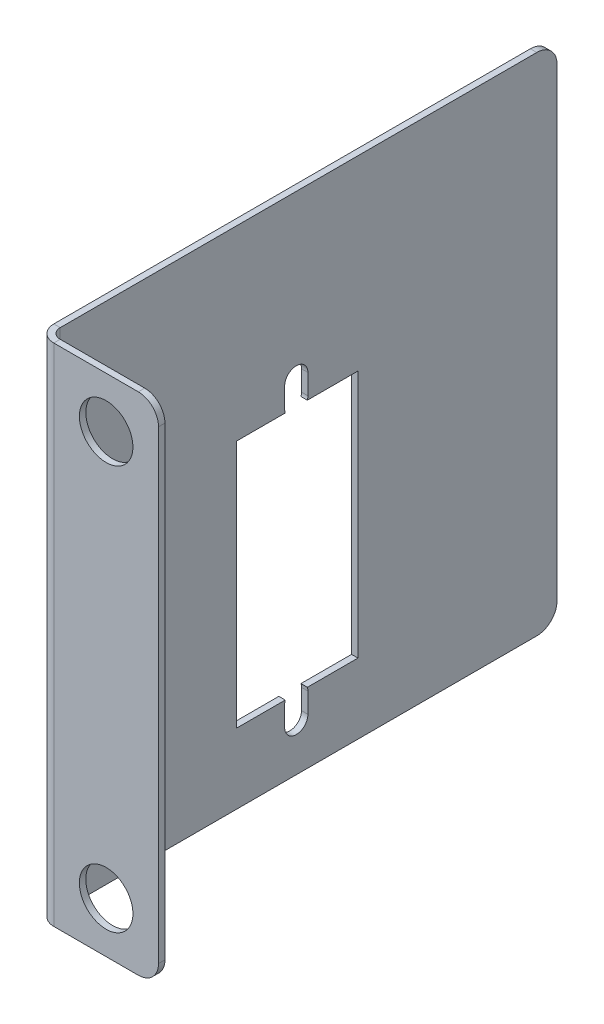
ISO-10303-21;
HEADER;
FILE_DESCRIPTION(('STEP AP214'),'2;1');
FILE_NAME('part.step','',(''),(''),'','','');
FILE_SCHEMA(('AUTOMOTIVE_DESIGN { 1 0 10303 214 1 1 1 1 }'));
ENDSEC;
DATA;
#1=APPLICATION_CONTEXT('core data for automotive mechanical design processes');
#2=APPLICATION_PROTOCOL_DEFINITION('international standard','automotive_design',2000,#1);
#3=PRODUCT_CONTEXT('',#1,'mechanical');
#4=PRODUCT('Part','Part','',(#3));
#5=PRODUCT_RELATED_PRODUCT_CATEGORY('part','',(#4));
#6=PRODUCT_DEFINITION_FORMATION('','',#4);
#7=PRODUCT_DEFINITION_CONTEXT('part definition',#1,'design');
#8=PRODUCT_DEFINITION('design','',#6,#7);
#9=PRODUCT_DEFINITION_SHAPE('','',#8);
#10=(LENGTH_UNIT() NAMED_UNIT(*) SI_UNIT(.MILLI.,.METRE.));
#11=(NAMED_UNIT(*) PLANE_ANGLE_UNIT() SI_UNIT($,.RADIAN.));
#12=(NAMED_UNIT(*) SI_UNIT($,.STERADIAN.) SOLID_ANGLE_UNIT());
#13=UNCERTAINTY_MEASURE_WITH_UNIT(LENGTH_MEASURE(1.E-05),#10,'distance_accuracy_value','');
#14=(GEOMETRIC_REPRESENTATION_CONTEXT(3) GLOBAL_UNCERTAINTY_ASSIGNED_CONTEXT((#13)) GLOBAL_UNIT_ASSIGNED_CONTEXT((#10,
#11,#12)) REPRESENTATION_CONTEXT('',''));
#15=CARTESIAN_POINT('',(0.,0.,0.));
#16=DIRECTION('',(0.,0.,1.));
#17=DIRECTION('',(1.,0.,0.));
#18=AXIS2_PLACEMENT_3D('',#15,#16,#17);
#19=CARTESIAN_POINT('',(-0.635,-25.,25.4));
#20=DIRECTION('',(0.,-1.,0.));
#21=DIRECTION('',(0.,0.,-1.));
#22=AXIS2_PLACEMENT_3D('',#19,#20,#21);
#23=PLANE('',#22);
#24=DIRECTION('',(0.,0.,-1.));
#25=VECTOR('',#24,1.);
#26=CARTESIAN_POINT('',(-0.635,-25.,25.4));
#27=LINE('',#26,#25);
#28=CARTESIAN_POINT('',(-0.635000000000009,-25.,23.765));
#29=VERTEX_POINT('',#28);
#30=CARTESIAN_POINT('',(-0.635,-25.,-23.4));
#31=VERTEX_POINT('',#30);
#32=EDGE_CURVE('E430',#29,#31,#27,.T.);
#33=ORIENTED_EDGE('',*,*,#32,.T.);
#34=DIRECTION('',(1.,0.,0.));
#35=VECTOR('',#34,1.);
#36=CARTESIAN_POINT('',(-0.635,-25.,-23.4));
#37=LINE('',#36,#35);
#38=CARTESIAN_POINT('',(0.,-25.,-23.4));
#39=VERTEX_POINT('',#38);
#40=EDGE_CURVE('E468',#31,#39,#37,.T.);
#41=ORIENTED_EDGE('',*,*,#40,.T.);
#42=DIRECTION('',(0.,0.,-1.));
#43=VECTOR('',#42,1.);
#44=CARTESIAN_POINT('',(0.,-25.,25.4));
#45=LINE('',#44,#43);
#46=CARTESIAN_POINT('',(0.,-25.,23.765));
#47=VERTEX_POINT('',#46);
#48=EDGE_CURVE('E428',#47,#39,#45,.T.);
#49=ORIENTED_EDGE('',*,*,#48,.F.);
#50=DIRECTION('',(-1.,0.,0.));
#51=VECTOR('',#50,1.);
#52=CARTESIAN_POINT('',(0.,-25.,23.765));
#53=LINE('',#52,#51);
#54=EDGE_CURVE('E305',#47,#29,#53,.T.);
#55=ORIENTED_EDGE('',*,*,#54,.T.);
#56=EDGE_LOOP('',(#33,#41,#49,#55));
#57=FACE_BOUND('',#56,.T.);
#58=ADVANCED_FACE('F62',(#57),#23,.T.);
#59=CARTESIAN_POINT('',(-0.635,0.,0.));
#60=DIRECTION('',(1.,0.,0.));
#61=DIRECTION('',(0.,0.,-1.));
#62=AXIS2_PLACEMENT_3D('',#59,#60,#61);
#63=PLANE('',#62);
#64=DIRECTION('',(0.,-1.,0.));
#65=VECTOR('',#64,1.);
#66=CARTESIAN_POINT('',(-0.635,-20.4000000000001,-0.749999999999812));
#67=LINE('',#66,#65);
#68=CARTESIAN_POINT('',(-0.635,-18.4000000000001,-0.749999999999813));
#69=VERTEX_POINT('',#68);
#70=CARTESIAN_POINT('',(-0.635,-20.4000000000001,-0.749999999999812));
#71=VERTEX_POINT('',#70);
#72=EDGE_CURVE('E323',#69,#71,#67,.T.);
#73=ORIENTED_EDGE('',*,*,#72,.F.);
#74=CARTESIAN_POINT('',(-0.635,-18.4000000000001,0.400000000000187));
#75=DIRECTION('',(-1.,0.,0.));
#76=DIRECTION('',(0.,0.,1.));
#77=AXIS2_PLACEMENT_3D('',#74,#75,#76);
#78=CIRCLE('',#77,1.15);
#79=CARTESIAN_POINT('',(-0.635,-18.0500000000002,-0.695445115010168));
#80=VERTEX_POINT('',#79);
#81=EDGE_CURVE('E341',#80,#69,#78,.T.);
#82=ORIENTED_EDGE('',*,*,#81,.F.);
#83=DIRECTION('',(0.,0.,-1.));
#84=VECTOR('',#83,1.);
#85=CARTESIAN_POINT('',(-0.635,-18.0500000000002,-5.69999999999969));
#86=LINE('',#85,#84);
#87=CARTESIAN_POINT('',(-0.635,-18.0500000000002,-5.69999999999969));
#88=VERTEX_POINT('',#87);
#89=EDGE_CURVE('E390',#80,#88,#86,.T.);
#90=ORIENTED_EDGE('',*,*,#89,.T.);
#91=DIRECTION('',(0.,1.,0.));
#92=VECTOR('',#91,1.);
#93=CARTESIAN_POINT('',(-0.635,-18.0500000000002,-5.69999999999969));
#94=LINE('',#93,#92);
#95=CARTESIAN_POINT('',(-0.635,6.54999999999979,-5.69999999999968));
#96=VERTEX_POINT('',#95);
#97=EDGE_CURVE('E395',#88,#96,#94,.T.);
#98=ORIENTED_EDGE('',*,*,#97,.T.);
#99=DIRECTION('',(0.,0.,1.));
#100=VECTOR('',#99,1.);
#101=CARTESIAN_POINT('',(-0.635,6.54999999999979,-5.69999999999968));
#102=LINE('',#101,#100);
#103=CARTESIAN_POINT('',(-0.635,6.54999999999979,-0.695445115010116));
#104=VERTEX_POINT('',#103);
#105=EDGE_CURVE('E399',#96,#104,#102,.T.);
#106=ORIENTED_EDGE('',*,*,#105,.T.);
#107=CARTESIAN_POINT('',(-0.635,6.89999999999986,0.400000000000192));
#108=DIRECTION('',(-1.,0.,0.));
#109=DIRECTION('',(0.,0.,1.));
#110=AXIS2_PLACEMENT_3D('',#107,#108,#109);
#111=CIRCLE('',#110,1.15);
#112=CARTESIAN_POINT('',(-0.635,6.89999999999986,-0.749999999999806));
#113=VERTEX_POINT('',#112);
#114=EDGE_CURVE('E338',#113,#104,#111,.T.);
#115=ORIENTED_EDGE('',*,*,#114,.F.);
#116=DIRECTION('',(0.,-1.,0.));
#117=VECTOR('',#116,1.);
#118=CARTESIAN_POINT('',(-0.635,6.89999999999986,-0.749999999999806));
#119=LINE('',#118,#117);
#120=CARTESIAN_POINT('',(-0.635,8.89999999999986,-0.749999999999806));
#121=VERTEX_POINT('',#120);
#122=EDGE_CURVE('E364',#121,#113,#119,.T.);
#123=ORIENTED_EDGE('',*,*,#122,.F.);
#124=CARTESIAN_POINT('',(-0.635,8.89999999999986,0.400000000000192));
#125=DIRECTION('',(-1.,0.,0.));
#126=DIRECTION('',(0.,0.,1.));
#127=AXIS2_PLACEMENT_3D('',#124,#125,#126);
#128=CIRCLE('',#127,1.15);
#129=CARTESIAN_POINT('',(-0.635,8.89999999999986,1.55000000000019));
#130=VERTEX_POINT('',#129);
#131=EDGE_CURVE('E367',#130,#121,#128,.T.);
#132=ORIENTED_EDGE('',*,*,#131,.F.);
#133=DIRECTION('',(0.,1.,0.));
#134=VECTOR('',#133,1.);
#135=CARTESIAN_POINT('',(-0.635,6.89999999999986,1.55000000000019));
#136=LINE('',#135,#134);
#137=CARTESIAN_POINT('',(-0.635,6.89999999999986,1.55000000000019));
#138=VERTEX_POINT('',#137);
#139=EDGE_CURVE('E371',#138,#130,#136,.T.);
#140=ORIENTED_EDGE('',*,*,#139,.F.);
#141=CARTESIAN_POINT('',(-0.635,6.54999999999979,1.4954451150105));
#142=VERTEX_POINT('',#141);
#143=EDGE_CURVE('E374',#142,#138,#111,.T.);
#144=ORIENTED_EDGE('',*,*,#143,.F.);
#145=CARTESIAN_POINT('',(-0.635,6.54999999999979,6.30000000000031));
#146=VERTEX_POINT('',#145);
#147=EDGE_CURVE('E398',#142,#146,#102,.T.);
#148=ORIENTED_EDGE('',*,*,#147,.T.);
#149=DIRECTION('',(0.,-1.,0.));
#150=VECTOR('',#149,1.);
#151=CARTESIAN_POINT('',(-0.635,-18.0500000000002,6.30000000000031));
#152=LINE('',#151,#150);
#153=CARTESIAN_POINT('',(-0.635,-18.0500000000002,6.30000000000031));
#154=VERTEX_POINT('',#153);
#155=EDGE_CURVE('E387',#146,#154,#152,.T.);
#156=ORIENTED_EDGE('',*,*,#155,.T.);
#157=CARTESIAN_POINT('',(-0.635,-18.0500000000002,1.49544511501054));
#158=VERTEX_POINT('',#157);
#159=EDGE_CURVE('E392',#154,#158,#86,.T.);
#160=ORIENTED_EDGE('',*,*,#159,.T.);
#161=CARTESIAN_POINT('',(-0.635,-18.4000000000001,1.55000000000019));
#162=VERTEX_POINT('',#161);
#163=EDGE_CURVE('E342',#162,#158,#78,.T.);
#164=ORIENTED_EDGE('',*,*,#163,.F.);
#165=DIRECTION('',(0.,1.,0.));
#166=VECTOR('',#165,1.);
#167=CARTESIAN_POINT('',(-0.635,-20.4000000000001,1.55000000000019));
#168=LINE('',#167,#166);
#169=CARTESIAN_POINT('',(-0.635,-20.4000000000001,1.55000000000019));
#170=VERTEX_POINT('',#169);
#171=EDGE_CURVE('E337',#170,#162,#168,.T.);
#172=ORIENTED_EDGE('',*,*,#171,.F.);
#173=CARTESIAN_POINT('',(-0.635,-20.4000000000001,0.400000000000188));
#174=DIRECTION('',(-1.,0.,0.));
#175=DIRECTION('',(0.,0.,1.));
#176=AXIS2_PLACEMENT_3D('',#173,#174,#175);
#177=CIRCLE('',#176,1.15);
#178=EDGE_CURVE('E334',#71,#170,#177,.T.);
#179=ORIENTED_EDGE('',*,*,#178,.F.);
#180=EDGE_LOOP('',(#73,#82,#90,#98,#106,#115,#123,#132,#140,#144,#148,#156,#160,#164,#172,#179));
#181=FACE_BOUND('',#180,.T.);
#182=DIRECTION('',(0.,1.,0.));
#183=VECTOR('',#182,1.);
#184=CARTESIAN_POINT('',(-0.635,25.,-25.4));
#185=LINE('',#184,#183);
#186=CARTESIAN_POINT('',(-0.635,-23.,-25.4));
#187=VERTEX_POINT('',#186);
#188=CARTESIAN_POINT('',(-0.635,23.,-25.4));
#189=VERTEX_POINT('',#188);
#190=EDGE_CURVE('E425',#187,#189,#185,.T.);
#191=ORIENTED_EDGE('',*,*,#190,.F.);
#192=CARTESIAN_POINT('',(-0.635,-23.,-23.4));
#193=DIRECTION('',(1.,0.,0.));
#194=DIRECTION('',(0.,0.,-1.));
#195=AXIS2_PLACEMENT_3D('',#192,#193,#194);
#196=CIRCLE('',#195,2.);
#197=EDGE_CURVE('E70',#187,#31,#196,.F.);
#198=ORIENTED_EDGE('',*,*,#197,.T.);
#199=ORIENTED_EDGE('',*,*,#32,.F.);
#200=DIRECTION('',(0.,-1.,0.));
#201=VECTOR('',#200,1.);
#202=CARTESIAN_POINT('',(-0.635000000000009,-25.,23.765));
#203=LINE('',#202,#201);
#204=CARTESIAN_POINT('',(-0.635,25.,23.765));
#205=VERTEX_POINT('',#204);
#206=EDGE_CURVE('E256',#29,#205,#203,.F.);
#207=ORIENTED_EDGE('',*,*,#206,.T.);
#208=DIRECTION('',(0.,0.,1.));
#209=VECTOR('',#208,1.);
#210=CARTESIAN_POINT('',(-0.635,25.,25.4));
#211=LINE('',#210,#209);
#212=CARTESIAN_POINT('',(-0.635,25.,-23.4));
#213=VERTEX_POINT('',#212);
#214=EDGE_CURVE('E427',#213,#205,#211,.T.);
#215=ORIENTED_EDGE('',*,*,#214,.F.);
#216=CARTESIAN_POINT('',(-0.635,23.,-23.4));
#217=DIRECTION('',(1.,0.,0.));
#218=DIRECTION('',(0.,0.,-1.));
#219=AXIS2_PLACEMENT_3D('',#216,#217,#218);
#220=CIRCLE('',#219,2.);
#221=EDGE_CURVE('E82',#213,#189,#220,.F.);
#222=ORIENTED_EDGE('',*,*,#221,.T.);
#223=EDGE_LOOP('',(#191,#198,#199,#207,#215,#222));
#224=FACE_BOUND('',#223,.T.);
#225=ADVANCED_FACE('F481',(#181,#224),#63,.F.);
#226=CARTESIAN_POINT('',(0.,0.,0.));
#227=DIRECTION('',(1.,0.,0.));
#228=DIRECTION('',(0.,0.,-1.));
#229=AXIS2_PLACEMENT_3D('',#226,#227,#228);
#230=PLANE('',#229);
#231=CARTESIAN_POINT('',(0.,-18.4000000000001,0.400000000000187));
#232=DIRECTION('',(-1.,0.,0.));
#233=DIRECTION('',(0.,0.,1.));
#234=AXIS2_PLACEMENT_3D('',#231,#232,#233);
#235=CIRCLE('',#234,1.15);
#236=CARTESIAN_POINT('',(0.,-18.0500000000002,-0.695445115010168));
#237=VERTEX_POINT('',#236);
#238=CARTESIAN_POINT('',(0.,-18.4000000000001,-0.749999999999813));
#239=VERTEX_POINT('',#238);
#240=EDGE_CURVE('E326',#237,#239,#235,.T.);
#241=ORIENTED_EDGE('',*,*,#240,.T.);
#242=DIRECTION('',(0.,-1.,0.));
#243=VECTOR('',#242,1.);
#244=CARTESIAN_POINT('',(0.,-20.4000000000001,-0.749999999999812));
#245=LINE('',#244,#243);
#246=CARTESIAN_POINT('',(0.,-20.4000000000001,-0.749999999999812));
#247=VERTEX_POINT('',#246);
#248=EDGE_CURVE('E330',#239,#247,#245,.T.);
#249=ORIENTED_EDGE('',*,*,#248,.T.);
#250=CARTESIAN_POINT('',(0.,-20.4000000000001,0.400000000000188));
#251=DIRECTION('',(-1.,0.,0.));
#252=DIRECTION('',(0.,0.,1.));
#253=AXIS2_PLACEMENT_3D('',#250,#251,#252);
#254=CIRCLE('',#253,1.15);
#255=CARTESIAN_POINT('',(0.,-20.4000000000001,1.55000000000019));
#256=VERTEX_POINT('',#255);
#257=EDGE_CURVE('E319',#247,#256,#254,.T.);
#258=ORIENTED_EDGE('',*,*,#257,.T.);
#259=DIRECTION('',(0.,1.,0.));
#260=VECTOR('',#259,1.);
#261=CARTESIAN_POINT('',(0.,-20.4000000000001,1.55000000000019));
#262=LINE('',#261,#260);
#263=CARTESIAN_POINT('',(0.,-18.4000000000001,1.55000000000019));
#264=VERTEX_POINT('',#263);
#265=EDGE_CURVE('E322',#256,#264,#262,.T.);
#266=ORIENTED_EDGE('',*,*,#265,.T.);
#267=CARTESIAN_POINT('',(0.,-18.0500000000002,1.49544511501054));
#268=VERTEX_POINT('',#267);
#269=EDGE_CURVE('E327',#264,#268,#235,.T.);
#270=ORIENTED_EDGE('',*,*,#269,.T.);
#271=DIRECTION('',(0.,0.,-1.));
#272=VECTOR('',#271,1.);
#273=CARTESIAN_POINT('',(0.,-18.0500000000002,-5.69999999999969));
#274=LINE('',#273,#272);
#275=CARTESIAN_POINT('',(0.,-18.0500000000002,6.30000000000031));
#276=VERTEX_POINT('',#275);
#277=EDGE_CURVE('E405',#276,#268,#274,.T.);
#278=ORIENTED_EDGE('',*,*,#277,.F.);
#279=DIRECTION('',(0.,-1.,0.));
#280=VECTOR('',#279,1.);
#281=CARTESIAN_POINT('',(0.,-18.0500000000002,6.30000000000031));
#282=LINE('',#281,#280);
#283=CARTESIAN_POINT('',(0.,6.54999999999979,6.30000000000031));
#284=VERTEX_POINT('',#283);
#285=EDGE_CURVE('E348',#284,#276,#282,.T.);
#286=ORIENTED_EDGE('',*,*,#285,.F.);
#287=DIRECTION('',(0.,0.,1.));
#288=VECTOR('',#287,1.);
#289=CARTESIAN_POINT('',(0.,6.54999999999979,-5.69999999999968));
#290=LINE('',#289,#288);
#291=CARTESIAN_POINT('',(0.,6.54999999999979,1.4954451150105));
#292=VERTEX_POINT('',#291);
#293=EDGE_CURVE('E411',#292,#284,#290,.T.);
#294=ORIENTED_EDGE('',*,*,#293,.F.);
#295=CARTESIAN_POINT('',(0.,6.89999999999986,0.400000000000192));
#296=DIRECTION('',(-1.,0.,0.));
#297=DIRECTION('',(0.,0.,1.));
#298=AXIS2_PLACEMENT_3D('',#295,#296,#297);
#299=CIRCLE('',#298,1.15);
#300=CARTESIAN_POINT('',(0.,6.89999999999986,1.55000000000019));
#301=VERTEX_POINT('',#300);
#302=EDGE_CURVE('E384',#292,#301,#299,.T.);
#303=ORIENTED_EDGE('',*,*,#302,.T.);
#304=DIRECTION('',(0.,1.,0.));
#305=VECTOR('',#304,1.);
#306=CARTESIAN_POINT('',(0.,6.89999999999986,1.55000000000019));
#307=LINE('',#306,#305);
#308=CARTESIAN_POINT('',(0.,8.89999999999986,1.55000000000019));
#309=VERTEX_POINT('',#308);
#310=EDGE_CURVE('E381',#301,#309,#307,.T.);
#311=ORIENTED_EDGE('',*,*,#310,.T.);
#312=CARTESIAN_POINT('',(0.,8.89999999999986,0.400000000000192));
#313=DIRECTION('',(-1.,0.,0.));
#314=DIRECTION('',(0.,0.,1.));
#315=AXIS2_PLACEMENT_3D('',#312,#313,#314);
#316=CIRCLE('',#315,1.15);
#317=CARTESIAN_POINT('',(0.,8.89999999999986,-0.749999999999806));
#318=VERTEX_POINT('',#317);
#319=EDGE_CURVE('E378',#309,#318,#316,.T.);
#320=ORIENTED_EDGE('',*,*,#319,.T.);
#321=DIRECTION('',(0.,-1.,0.));
#322=VECTOR('',#321,1.);
#323=CARTESIAN_POINT('',(0.,6.89999999999986,-0.749999999999806));
#324=LINE('',#323,#322);
#325=CARTESIAN_POINT('',(0.,6.89999999999986,-0.749999999999806));
#326=VERTEX_POINT('',#325);
#327=EDGE_CURVE('E358',#318,#326,#324,.T.);
#328=ORIENTED_EDGE('',*,*,#327,.T.);
#329=CARTESIAN_POINT('',(0.,6.54999999999979,-0.695445115010116));
#330=VERTEX_POINT('',#329);
#331=EDGE_CURVE('E368',#326,#330,#299,.T.);
#332=ORIENTED_EDGE('',*,*,#331,.T.);
#333=CARTESIAN_POINT('',(0.,6.54999999999979,-5.69999999999968));
#334=VERTEX_POINT('',#333);
#335=EDGE_CURVE('E391',#334,#330,#290,.T.);
#336=ORIENTED_EDGE('',*,*,#335,.F.);
#337=DIRECTION('',(0.,1.,0.));
#338=VECTOR('',#337,1.);
#339=CARTESIAN_POINT('',(0.,-18.0500000000002,-5.69999999999969));
#340=LINE('',#339,#338);
#341=CARTESIAN_POINT('',(0.,-18.0500000000002,-5.69999999999969));
#342=VERTEX_POINT('',#341);
#343=EDGE_CURVE('E408',#342,#334,#340,.T.);
#344=ORIENTED_EDGE('',*,*,#343,.F.);
#345=EDGE_CURVE('E404',#237,#342,#274,.T.);
#346=ORIENTED_EDGE('',*,*,#345,.F.);
#347=EDGE_LOOP('',(#241,#249,#258,#266,#270,#278,#286,#294,#303,#311,#320,#328,#332,#336,#344,#346));
#348=FACE_BOUND('',#347,.T.);
#349=ORIENTED_EDGE('',*,*,#48,.T.);
#350=CARTESIAN_POINT('',(0.,-23.,-23.4));
#351=DIRECTION('',(1.,0.,0.));
#352=DIRECTION('',(0.,0.,-1.));
#353=AXIS2_PLACEMENT_3D('',#350,#351,#352);
#354=CIRCLE('',#353,2.);
#355=CARTESIAN_POINT('',(0.,-23.,-25.4));
#356=VERTEX_POINT('',#355);
#357=EDGE_CURVE('E473',#39,#356,#354,.T.);
#358=ORIENTED_EDGE('',*,*,#357,.T.);
#359=DIRECTION('',(0.,1.,0.));
#360=VECTOR('',#359,1.);
#361=CARTESIAN_POINT('',(0.,25.,-25.4));
#362=LINE('',#361,#360);
#363=CARTESIAN_POINT('',(0.,23.,-25.4));
#364=VERTEX_POINT('',#363);
#365=EDGE_CURVE('E417',#356,#364,#362,.T.);
#366=ORIENTED_EDGE('',*,*,#365,.T.);
#367=CARTESIAN_POINT('',(0.,23.,-23.4));
#368=DIRECTION('',(1.,0.,0.));
#369=DIRECTION('',(0.,0.,-1.));
#370=AXIS2_PLACEMENT_3D('',#367,#368,#369);
#371=CIRCLE('',#370,2.);
#372=CARTESIAN_POINT('',(0.,25.,-23.4));
#373=VERTEX_POINT('',#372);
#374=EDGE_CURVE('E471',#364,#373,#371,.T.);
#375=ORIENTED_EDGE('',*,*,#374,.T.);
#376=DIRECTION('',(0.,0.,1.));
#377=VECTOR('',#376,1.);
#378=CARTESIAN_POINT('',(0.,25.,25.4));
#379=LINE('',#378,#377);
#380=CARTESIAN_POINT('',(0.,25.,23.765));
#381=VERTEX_POINT('',#380);
#382=EDGE_CURVE('E436',#373,#381,#379,.T.);
#383=ORIENTED_EDGE('',*,*,#382,.T.);
#384=DIRECTION('',(0.,-1.,0.));
#385=VECTOR('',#384,1.);
#386=CARTESIAN_POINT('',(0.,-25.,23.765));
#387=LINE('',#386,#385);
#388=EDGE_CURVE('E309',#47,#381,#387,.F.);
#389=ORIENTED_EDGE('',*,*,#388,.F.);
#390=EDGE_LOOP('',(#349,#358,#366,#375,#383,#389));
#391=FACE_BOUND('',#390,.T.);
#392=ADVANCED_FACE('F490',(#348,#391),#230,.T.);
#393=CARTESIAN_POINT('',(-0.635,6.54999999999979,-5.69999999999968));
#394=DIRECTION('',(0.,1.,0.));
#395=DIRECTION('',(0.,0.,1.));
#396=AXIS2_PLACEMENT_3D('',#393,#394,#395);
#397=PLANE('',#396);
#398=ORIENTED_EDGE('',*,*,#335,.T.);
#399=DIRECTION('',(-1.,0.,0.));
#400=VECTOR('',#399,1.);
#401=CARTESIAN_POINT('',(0.,6.54999999999979,-0.695445115010116));
#402=LINE('',#401,#400);
#403=EDGE_CURVE('E448',#330,#104,#402,.T.);
#404=ORIENTED_EDGE('',*,*,#403,.T.);
#405=ORIENTED_EDGE('',*,*,#105,.F.);
#406=DIRECTION('',(1.,0.,0.));
#407=VECTOR('',#406,1.);
#408=CARTESIAN_POINT('',(-0.635,6.54999999999979,-5.69999999999968));
#409=LINE('',#408,#407);
#410=EDGE_CURVE('E418',#96,#334,#409,.T.);
#411=ORIENTED_EDGE('',*,*,#410,.T.);
#412=EDGE_LOOP('',(#398,#404,#405,#411));
#413=FACE_BOUND('',#412,.T.);
#414=ADVANCED_FACE('F551',(#413),#397,.F.);
#415=CARTESIAN_POINT('',(-0.635,-18.0500000000002,-5.69999999999969));
#416=DIRECTION('',(0.,-1.,0.));
#417=DIRECTION('',(0.,0.,-1.));
#418=AXIS2_PLACEMENT_3D('',#415,#416,#417);
#419=PLANE('',#418);
#420=ORIENTED_EDGE('',*,*,#277,.T.);
#421=DIRECTION('',(-1.,0.,0.));
#422=VECTOR('',#421,1.);
#423=CARTESIAN_POINT('',(0.,-18.0500000000002,1.49544511501054));
#424=LINE('',#423,#422);
#425=EDGE_CURVE('E442',#268,#158,#424,.T.);
#426=ORIENTED_EDGE('',*,*,#425,.T.);
#427=ORIENTED_EDGE('',*,*,#159,.F.);
#428=DIRECTION('',(1.,0.,0.));
#429=VECTOR('',#428,1.);
#430=CARTESIAN_POINT('',(-0.635,-18.0500000000002,6.30000000000031));
#431=LINE('',#430,#429);
#432=EDGE_CURVE('E402',#154,#276,#431,.T.);
#433=ORIENTED_EDGE('',*,*,#432,.T.);
#434=EDGE_LOOP('',(#420,#426,#427,#433));
#435=FACE_BOUND('',#434,.T.);
#436=ADVANCED_FACE('F546',(#435),#419,.F.);
#437=CARTESIAN_POINT('',(-0.635,25.,-25.4));
#438=DIRECTION('',(0.,0.,-1.));
#439=DIRECTION('',(0.,1.,0.));
#440=AXIS2_PLACEMENT_3D('',#437,#438,#439);
#441=PLANE('',#440);
#442=ORIENTED_EDGE('',*,*,#365,.F.);
#443=DIRECTION('',(1.,0.,0.));
#444=VECTOR('',#443,1.);
#445=CARTESIAN_POINT('',(-0.635,-23.,-25.4));
#446=LINE('',#445,#444);
#447=EDGE_CURVE('E478',#356,#187,#446,.F.);
#448=ORIENTED_EDGE('',*,*,#447,.T.);
#449=ORIENTED_EDGE('',*,*,#190,.T.);
#450=DIRECTION('',(1.,0.,0.));
#451=VECTOR('',#450,1.);
#452=CARTESIAN_POINT('',(-0.635,23.,-25.4));
#453=LINE('',#452,#451);
#454=EDGE_CURVE('E475',#189,#364,#453,.T.);
#455=ORIENTED_EDGE('',*,*,#454,.T.);
#456=EDGE_LOOP('',(#442,#448,#449,#455));
#457=FACE_BOUND('',#456,.T.);
#458=ADVANCED_FACE('F492',(#457),#441,.T.);
#459=CARTESIAN_POINT('',(-0.635,25.,25.4));
#460=DIRECTION('',(0.,1.,0.));
#461=DIRECTION('',(0.,0.,1.));
#462=AXIS2_PLACEMENT_3D('',#459,#460,#461);
#463=PLANE('',#462);
#464=ORIENTED_EDGE('',*,*,#382,.F.);
#465=DIRECTION('',(1.,0.,0.));
#466=VECTOR('',#465,1.);
#467=CARTESIAN_POINT('',(-0.635,25.,-23.4));
#468=LINE('',#467,#466);
#469=EDGE_CURVE('E13',#373,#213,#468,.F.);
#470=ORIENTED_EDGE('',*,*,#469,.T.);
#471=ORIENTED_EDGE('',*,*,#214,.T.);
#472=DIRECTION('',(-1.,0.,0.));
#473=VECTOR('',#472,1.);
#474=CARTESIAN_POINT('',(0.,25.,23.765));
#475=LINE('',#474,#473);
#476=EDGE_CURVE('E313',#381,#205,#475,.T.);
#477=ORIENTED_EDGE('',*,*,#476,.F.);
#478=EDGE_LOOP('',(#464,#470,#471,#477));
#479=FACE_BOUND('',#478,.T.);
#480=ADVANCED_FACE('F496',(#479),#463,.T.);
#481=CARTESIAN_POINT('',(-0.635,-18.0500000000002,6.30000000000031));
#482=DIRECTION('',(0.,0.,1.));
#483=DIRECTION('',(0.,-1.,0.));
#484=AXIS2_PLACEMENT_3D('',#481,#482,#483);
#485=PLANE('',#484);
#486=ORIENTED_EDGE('',*,*,#285,.T.);
#487=ORIENTED_EDGE('',*,*,#432,.F.);
#488=ORIENTED_EDGE('',*,*,#155,.F.);
#489=DIRECTION('',(1.,0.,0.));
#490=VECTOR('',#489,1.);
#491=CARTESIAN_POINT('',(-0.635,6.54999999999979,6.30000000000031));
#492=LINE('',#491,#490);
#493=EDGE_CURVE('E414',#146,#284,#492,.T.);
#494=ORIENTED_EDGE('',*,*,#493,.T.);
#495=EDGE_LOOP('',(#486,#487,#488,#494));
#496=FACE_BOUND('',#495,.T.);
#497=ADVANCED_FACE('F544',(#496),#485,.F.);
#498=ORIENTED_EDGE('',*,*,#147,.F.);
#499=DIRECTION('',(-1.,0.,0.));
#500=VECTOR('',#499,1.);
#501=CARTESIAN_POINT('',(0.,6.54999999999979,1.4954451150105));
#502=LINE('',#501,#500);
#503=EDGE_CURVE('E445',#142,#292,#502,.F.);
#504=ORIENTED_EDGE('',*,*,#503,.T.);
#505=ORIENTED_EDGE('',*,*,#293,.T.);
#506=ORIENTED_EDGE('',*,*,#493,.F.);
#507=EDGE_LOOP('',(#498,#504,#505,#506));
#508=FACE_BOUND('',#507,.T.);
#509=ADVANCED_FACE('F561',(#508),#397,.F.);
#510=CARTESIAN_POINT('',(-0.635,-18.0500000000002,-5.69999999999969));
#511=DIRECTION('',(0.,0.,-1.));
#512=DIRECTION('',(0.,1.,0.));
#513=AXIS2_PLACEMENT_3D('',#510,#511,#512);
#514=PLANE('',#513);
#515=ORIENTED_EDGE('',*,*,#343,.T.);
#516=ORIENTED_EDGE('',*,*,#410,.F.);
#517=ORIENTED_EDGE('',*,*,#97,.F.);
#518=DIRECTION('',(1.,0.,0.));
#519=VECTOR('',#518,1.);
#520=CARTESIAN_POINT('',(-0.635,-18.0500000000002,-5.69999999999969));
#521=LINE('',#520,#519);
#522=EDGE_CURVE('E420',#88,#342,#521,.T.);
#523=ORIENTED_EDGE('',*,*,#522,.T.);
#524=EDGE_LOOP('',(#515,#516,#517,#523));
#525=FACE_BOUND('',#524,.T.);
#526=ADVANCED_FACE('F566',(#525),#514,.F.);
#527=ORIENTED_EDGE('',*,*,#89,.F.);
#528=DIRECTION('',(-1.,0.,0.));
#529=VECTOR('',#528,1.);
#530=CARTESIAN_POINT('',(0.,-18.0500000000002,-0.695445115010168));
#531=LINE('',#530,#529);
#532=EDGE_CURVE('E433',#80,#237,#531,.F.);
#533=ORIENTED_EDGE('',*,*,#532,.T.);
#534=ORIENTED_EDGE('',*,*,#345,.T.);
#535=ORIENTED_EDGE('',*,*,#522,.F.);
#536=EDGE_LOOP('',(#527,#533,#534,#535));
#537=FACE_BOUND('',#536,.T.);
#538=ADVANCED_FACE('F554',(#537),#419,.F.);
#539=CARTESIAN_POINT('',(0.,-18.4000000000001,0.400000000000187));
#540=DIRECTION('',(-1.,0.,0.));
#541=DIRECTION('',(0.,0.,1.));
#542=AXIS2_PLACEMENT_3D('',#539,#540,#541);
#543=CYLINDRICAL_SURFACE('',#542,1.15);
#544=ORIENTED_EDGE('',*,*,#269,.F.);
#545=DIRECTION('',(-1.,0.,0.));
#546=VECTOR('',#545,1.);
#547=CARTESIAN_POINT('',(0.,-18.4000000000001,1.55000000000019));
#548=LINE('',#547,#546);
#549=EDGE_CURVE('E352',#264,#162,#548,.T.);
#550=ORIENTED_EDGE('',*,*,#549,.T.);
#551=ORIENTED_EDGE('',*,*,#163,.T.);
#552=ORIENTED_EDGE('',*,*,#425,.F.);
#553=EDGE_LOOP('',(#544,#550,#551,#552));
#554=FACE_BOUND('',#553,.T.);
#555=ADVANCED_FACE('F565',(#554),#543,.F.);
#556=ORIENTED_EDGE('',*,*,#81,.T.);
#557=DIRECTION('',(-1.,0.,0.));
#558=VECTOR('',#557,1.);
#559=CARTESIAN_POINT('',(0.,-18.4000000000001,-0.749999999999813));
#560=LINE('',#559,#558);
#561=EDGE_CURVE('E349',#239,#69,#560,.T.);
#562=ORIENTED_EDGE('',*,*,#561,.F.);
#563=ORIENTED_EDGE('',*,*,#240,.F.);
#564=ORIENTED_EDGE('',*,*,#532,.F.);
#565=EDGE_LOOP('',(#556,#562,#563,#564));
#566=FACE_BOUND('',#565,.T.);
#567=ADVANCED_FACE('F571',(#566),#543,.F.);
#568=CARTESIAN_POINT('',(0.,-20.4000000000001,0.400000000000188));
#569=DIRECTION('',(-1.,0.,0.));
#570=DIRECTION('',(0.,0.,1.));
#571=AXIS2_PLACEMENT_3D('',#568,#569,#570);
#572=CYLINDRICAL_SURFACE('',#571,1.15);
#573=ORIENTED_EDGE('',*,*,#178,.T.);
#574=DIRECTION('',(-1.,0.,0.));
#575=VECTOR('',#574,1.);
#576=CARTESIAN_POINT('',(0.,-20.4000000000001,1.55000000000019));
#577=LINE('',#576,#575);
#578=EDGE_CURVE('E333',#256,#170,#577,.T.);
#579=ORIENTED_EDGE('',*,*,#578,.F.);
#580=ORIENTED_EDGE('',*,*,#257,.F.);
#581=DIRECTION('',(-1.,0.,0.));
#582=VECTOR('',#581,1.);
#583=CARTESIAN_POINT('',(0.,-20.4000000000001,-0.749999999999812));
#584=LINE('',#583,#582);
#585=EDGE_CURVE('E346',#247,#71,#584,.T.);
#586=ORIENTED_EDGE('',*,*,#585,.T.);
#587=EDGE_LOOP('',(#573,#579,#580,#586));
#588=FACE_BOUND('',#587,.T.);
#589=ADVANCED_FACE('F625',(#588),#572,.F.);
#590=CARTESIAN_POINT('',(0.,-20.4000000000001,-0.749999999999812));
#591=DIRECTION('',(0.,0.,-1.));
#592=DIRECTION('',(0.,1.,0.));
#593=AXIS2_PLACEMENT_3D('',#590,#591,#592);
#594=PLANE('',#593);
#595=ORIENTED_EDGE('',*,*,#72,.T.);
#596=ORIENTED_EDGE('',*,*,#585,.F.);
#597=ORIENTED_EDGE('',*,*,#248,.F.);
#598=ORIENTED_EDGE('',*,*,#561,.T.);
#599=EDGE_LOOP('',(#595,#596,#597,#598));
#600=FACE_BOUND('',#599,.T.);
#601=ADVANCED_FACE('F627',(#600),#594,.F.);
#602=CARTESIAN_POINT('',(0.,-20.4000000000001,1.55000000000019));
#603=DIRECTION('',(0.,0.,1.));
#604=DIRECTION('',(0.,-1.,0.));
#605=AXIS2_PLACEMENT_3D('',#602,#603,#604);
#606=PLANE('',#605);
#607=ORIENTED_EDGE('',*,*,#171,.T.);
#608=ORIENTED_EDGE('',*,*,#549,.F.);
#609=ORIENTED_EDGE('',*,*,#265,.F.);
#610=ORIENTED_EDGE('',*,*,#578,.T.);
#611=EDGE_LOOP('',(#607,#608,#609,#610));
#612=FACE_BOUND('',#611,.T.);
#613=ADVANCED_FACE('F622',(#612),#606,.F.);
#614=CARTESIAN_POINT('',(0.,6.89999999999986,0.400000000000192));
#615=DIRECTION('',(-1.,0.,0.));
#616=DIRECTION('',(0.,0.,1.));
#617=AXIS2_PLACEMENT_3D('',#614,#615,#616);
#618=CYLINDRICAL_SURFACE('',#617,1.15);
#619=ORIENTED_EDGE('',*,*,#331,.F.);
#620=DIRECTION('',(-1.,0.,0.));
#621=VECTOR('',#620,1.);
#622=CARTESIAN_POINT('',(0.,6.89999999999986,-0.749999999999806));
#623=LINE('',#622,#621);
#624=EDGE_CURVE('E316',#326,#113,#623,.T.);
#625=ORIENTED_EDGE('',*,*,#624,.T.);
#626=ORIENTED_EDGE('',*,*,#114,.T.);
#627=ORIENTED_EDGE('',*,*,#403,.F.);
#628=EDGE_LOOP('',(#619,#625,#626,#627));
#629=FACE_BOUND('',#628,.T.);
#630=ADVANCED_FACE('F590',(#629),#618,.F.);
#631=ORIENTED_EDGE('',*,*,#143,.T.);
#632=DIRECTION('',(-1.,0.,0.));
#633=VECTOR('',#632,1.);
#634=CARTESIAN_POINT('',(0.,6.89999999999986,1.55000000000019));
#635=LINE('',#634,#633);
#636=EDGE_CURVE('E355',#301,#138,#635,.T.);
#637=ORIENTED_EDGE('',*,*,#636,.F.);
#638=ORIENTED_EDGE('',*,*,#302,.F.);
#639=ORIENTED_EDGE('',*,*,#503,.F.);
#640=EDGE_LOOP('',(#631,#637,#638,#639));
#641=FACE_BOUND('',#640,.T.);
#642=ADVANCED_FACE('F605',(#641),#618,.F.);
#643=CARTESIAN_POINT('',(0.,6.89999999999986,-0.749999999999806));
#644=DIRECTION('',(0.,0.,-1.));
#645=DIRECTION('',(-1.,0.,0.));
#646=AXIS2_PLACEMENT_3D('',#643,#644,#645);
#647=PLANE('',#646);
#648=ORIENTED_EDGE('',*,*,#122,.T.);
#649=ORIENTED_EDGE('',*,*,#624,.F.);
#650=ORIENTED_EDGE('',*,*,#327,.F.);
#651=DIRECTION('',(-1.,0.,0.));
#652=VECTOR('',#651,1.);
#653=CARTESIAN_POINT('',(0.,8.89999999999986,-0.749999999999806));
#654=LINE('',#653,#652);
#655=EDGE_CURVE('E361',#318,#121,#654,.T.);
#656=ORIENTED_EDGE('',*,*,#655,.T.);
#657=EDGE_LOOP('',(#648,#649,#650,#656));
#658=FACE_BOUND('',#657,.T.);
#659=ADVANCED_FACE('F593',(#658),#647,.F.);
#660=CARTESIAN_POINT('',(0.,8.89999999999986,0.400000000000192));
#661=DIRECTION('',(-1.,0.,0.));
#662=DIRECTION('',(0.,0.,1.));
#663=AXIS2_PLACEMENT_3D('',#660,#661,#662);
#664=CYLINDRICAL_SURFACE('',#663,1.15);
#665=ORIENTED_EDGE('',*,*,#131,.T.);
#666=ORIENTED_EDGE('',*,*,#655,.F.);
#667=ORIENTED_EDGE('',*,*,#319,.F.);
#668=DIRECTION('',(-1.,0.,0.));
#669=VECTOR('',#668,1.);
#670=CARTESIAN_POINT('',(0.,8.89999999999986,1.55000000000019));
#671=LINE('',#670,#669);
#672=EDGE_CURVE('E359',#309,#130,#671,.T.);
#673=ORIENTED_EDGE('',*,*,#672,.T.);
#674=EDGE_LOOP('',(#665,#666,#667,#673));
#675=FACE_BOUND('',#674,.T.);
#676=ADVANCED_FACE('F596',(#675),#664,.F.);
#677=CARTESIAN_POINT('',(0.,6.89999999999986,1.55000000000019));
#678=DIRECTION('',(0.,0.,1.));
#679=DIRECTION('',(1.,0.,0.));
#680=AXIS2_PLACEMENT_3D('',#677,#678,#679);
#681=PLANE('',#680);
#682=ORIENTED_EDGE('',*,*,#139,.T.);
#683=ORIENTED_EDGE('',*,*,#672,.F.);
#684=ORIENTED_EDGE('',*,*,#310,.F.);
#685=ORIENTED_EDGE('',*,*,#636,.T.);
#686=EDGE_LOOP('',(#682,#683,#684,#685));
#687=FACE_BOUND('',#686,.T.);
#688=ADVANCED_FACE('F601',(#687),#681,.F.);
#689=CARTESIAN_POINT('',(0.999999999999996,25.,23.765));
#690=DIRECTION('',(0.,1.,0.));
#691=DIRECTION('',(0.,0.,1.));
#692=AXIS2_PLACEMENT_3D('',#689,#690,#691);
#693=PLANE('',#692);
#694=DIRECTION('',(0.,0.,-1.));
#695=VECTOR('',#694,1.);
#696=CARTESIAN_POINT('',(0.999999999999997,25.,25.4));
#697=LINE('',#696,#695);
#698=CARTESIAN_POINT('',(0.999999999999992,25.,24.765));
#699=VERTEX_POINT('',#698);
#700=CARTESIAN_POINT('',(0.99999999999999,25.,25.4));
#701=VERTEX_POINT('',#700);
#702=EDGE_CURVE('E299',#699,#701,#697,.F.);
#703=ORIENTED_EDGE('',*,*,#702,.F.);
#704=CARTESIAN_POINT('',(0.999999999999996,25.,23.765));
#705=DIRECTION('',(0.,-1.,0.));
#706=DIRECTION('',(0.,0.,-1.));
#707=AXIS2_PLACEMENT_3D('',#704,#705,#706);
#708=CIRCLE('',#707,1.);
#709=EDGE_CURVE('E259',#381,#699,#708,.F.);
#710=ORIENTED_EDGE('',*,*,#709,.F.);
#711=ORIENTED_EDGE('',*,*,#476,.T.);
#712=CARTESIAN_POINT('',(0.999999999999996,25.,23.765));
#713=DIRECTION('',(0.,-1.,0.));
#714=DIRECTION('',(0.,0.,-1.));
#715=AXIS2_PLACEMENT_3D('',#712,#713,#714);
#716=CIRCLE('',#715,1.635);
#717=EDGE_CURVE('E304',#205,#701,#716,.F.);
#718=ORIENTED_EDGE('',*,*,#717,.T.);
#719=EDGE_LOOP('',(#703,#710,#711,#718));
#720=FACE_BOUND('',#719,.T.);
#721=ADVANCED_FACE('F503',(#720),#693,.T.);
#722=CARTESIAN_POINT('',(0.999999999999996,-25.,23.765));
#723=DIRECTION('',(0.,1.,0.));
#724=DIRECTION('',(0.,0.,1.));
#725=AXIS2_PLACEMENT_3D('',#722,#723,#724);
#726=PLANE('',#725);
#727=CARTESIAN_POINT('',(0.999999999999996,-25.,23.765));
#728=DIRECTION('',(0.,-1.,0.));
#729=DIRECTION('',(0.,0.,-1.));
#730=AXIS2_PLACEMENT_3D('',#727,#728,#729);
#731=CIRCLE('',#730,1.);
#732=CARTESIAN_POINT('',(0.999999999999992,-25.,24.765));
#733=VERTEX_POINT('',#732);
#734=EDGE_CURVE('E266',#733,#47,#731,.T.);
#735=ORIENTED_EDGE('',*,*,#734,.F.);
#736=DIRECTION('',(0.,0.,-1.));
#737=VECTOR('',#736,1.);
#738=CARTESIAN_POINT('',(0.999999999999994,-25.,24.765));
#739=LINE('',#738,#737);
#740=CARTESIAN_POINT('',(0.999999999999994,-25.,25.4));
#741=VERTEX_POINT('',#740);
#742=EDGE_CURVE('E263',#733,#741,#739,.F.);
#743=ORIENTED_EDGE('',*,*,#742,.T.);
#744=CARTESIAN_POINT('',(0.999999999999996,-25.,23.765));
#745=DIRECTION('',(0.,-1.,0.));
#746=DIRECTION('',(0.,0.,-1.));
#747=AXIS2_PLACEMENT_3D('',#744,#745,#746);
#748=CIRCLE('',#747,1.635);
#749=EDGE_CURVE('E248',#741,#29,#748,.T.);
#750=ORIENTED_EDGE('',*,*,#749,.T.);
#751=ORIENTED_EDGE('',*,*,#54,.F.);
#752=EDGE_LOOP('',(#735,#743,#750,#751));
#753=FACE_BOUND('',#752,.T.);
#754=ADVANCED_FACE('F264',(#753),#726,.F.);
#755=CARTESIAN_POINT('',(0.999999999999996,-25.,23.765));
#756=DIRECTION('',(0.,-1.,0.));
#757=DIRECTION('',(0.,0.,1.));
#758=AXIS2_PLACEMENT_3D('',#755,#756,#757);
#759=CYLINDRICAL_SURFACE('',#758,1.635);
#760=ORIENTED_EDGE('',*,*,#206,.F.);
#761=ORIENTED_EDGE('',*,*,#749,.F.);
#762=DIRECTION('',(0.,-1.,0.));
#763=VECTOR('',#762,1.);
#764=CARTESIAN_POINT('',(0.999999999999997,25.,25.4));
#765=LINE('',#764,#763);
#766=EDGE_CURVE('E253',#741,#701,#765,.F.);
#767=ORIENTED_EDGE('',*,*,#766,.T.);
#768=ORIENTED_EDGE('',*,*,#717,.F.);
#769=EDGE_LOOP('',(#760,#761,#767,#768));
#770=FACE_BOUND('',#769,.T.);
#771=ADVANCED_FACE('F250',(#770),#759,.T.);
#772=CARTESIAN_POINT('',(0.999999999999996,-25.,23.765));
#773=DIRECTION('',(0.,-1.,0.));
#774=DIRECTION('',(0.,0.,1.));
#775=AXIS2_PLACEMENT_3D('',#772,#773,#774);
#776=CYLINDRICAL_SURFACE('',#775,1.);
#777=ORIENTED_EDGE('',*,*,#388,.T.);
#778=ORIENTED_EDGE('',*,*,#709,.T.);
#779=DIRECTION('',(0.,-1.,0.));
#780=VECTOR('',#779,1.);
#781=CARTESIAN_POINT('',(0.999999999999997,25.,24.765));
#782=LINE('',#781,#780);
#783=EDGE_CURVE('E271',#699,#733,#782,.T.);
#784=ORIENTED_EDGE('',*,*,#783,.T.);
#785=ORIENTED_EDGE('',*,*,#734,.T.);
#786=EDGE_LOOP('',(#777,#778,#784,#785));
#787=FACE_BOUND('',#786,.T.);
#788=ADVANCED_FACE('F500',(#787),#776,.F.);
#789=CARTESIAN_POINT('',(0.,25.,25.4));
#790=DIRECTION('',(0.,-1.,0.));
#791=DIRECTION('',(0.,0.,-1.));
#792=AXIS2_PLACEMENT_3D('',#789,#790,#791);
#793=PLANE('',#792);
#794=DIRECTION('',(-1.,0.,0.));
#795=VECTOR('',#794,1.);
#796=CARTESIAN_POINT('',(0.,25.,25.4));
#797=LINE('',#796,#795);
#798=CARTESIAN_POINT('',(9.365,25.,25.4));
#799=VERTEX_POINT('',#798);
#800=EDGE_CURVE('E280',#799,#701,#797,.T.);
#801=ORIENTED_EDGE('',*,*,#800,.F.);
#802=DIRECTION('',(0.,0.,-1.));
#803=VECTOR('',#802,1.);
#804=CARTESIAN_POINT('',(9.365,25.,25.4));
#805=LINE('',#804,#803);
#806=CARTESIAN_POINT('',(9.365,25.,24.765));
#807=VERTEX_POINT('',#806);
#808=EDGE_CURVE('E451',#799,#807,#805,.T.);
#809=ORIENTED_EDGE('',*,*,#808,.T.);
#810=DIRECTION('',(1.,0.,0.));
#811=VECTOR('',#810,1.);
#812=CARTESIAN_POINT('',(0.,25.,24.765));
#813=LINE('',#812,#811);
#814=EDGE_CURVE('E281',#807,#699,#813,.F.);
#815=ORIENTED_EDGE('',*,*,#814,.T.);
#816=ORIENTED_EDGE('',*,*,#702,.T.);
#817=EDGE_LOOP('',(#801,#809,#815,#816));
#818=FACE_BOUND('',#817,.T.);
#819=ADVANCED_FACE('F505',(#818),#793,.F.);
#820=CARTESIAN_POINT('',(11.365,-25.,25.4));
#821=DIRECTION('',(0.,1.,0.));
#822=DIRECTION('',(0.,0.,1.));
#823=AXIS2_PLACEMENT_3D('',#820,#821,#822);
#824=PLANE('',#823);
#825=DIRECTION('',(-1.,0.,0.));
#826=VECTOR('',#825,1.);
#827=CARTESIAN_POINT('',(11.365,-25.,24.765));
#828=LINE('',#827,#826);
#829=CARTESIAN_POINT('',(9.365,-25.,24.765));
#830=VERTEX_POINT('',#829);
#831=EDGE_CURVE('E295',#733,#830,#828,.F.);
#832=ORIENTED_EDGE('',*,*,#831,.T.);
#833=DIRECTION('',(0.,0.,-1.));
#834=VECTOR('',#833,1.);
#835=CARTESIAN_POINT('',(9.365,-25.,25.4));
#836=LINE('',#835,#834);
#837=CARTESIAN_POINT('',(9.365,-25.,25.4));
#838=VERTEX_POINT('',#837);
#839=EDGE_CURVE('E285',#830,#838,#836,.F.);
#840=ORIENTED_EDGE('',*,*,#839,.T.);
#841=DIRECTION('',(1.,0.,0.));
#842=VECTOR('',#841,1.);
#843=CARTESIAN_POINT('',(0.,-25.,25.4));
#844=LINE('',#843,#842);
#845=EDGE_CURVE('E277',#741,#838,#844,.T.);
#846=ORIENTED_EDGE('',*,*,#845,.F.);
#847=ORIENTED_EDGE('',*,*,#742,.F.);
#848=EDGE_LOOP('',(#832,#840,#846,#847));
#849=FACE_BOUND('',#848,.T.);
#850=ADVANCED_FACE('F283',(#849),#824,.F.);
#851=CARTESIAN_POINT('',(0.,0.,25.4));
#852=DIRECTION('',(0.,0.,-1.));
#853=DIRECTION('',(-1.,0.,0.));
#854=AXIS2_PLACEMENT_3D('',#851,#852,#853);
#855=PLANE('',#854);
#856=CARTESIAN_POINT('',(6.1825,-20.,25.4000000000001));
#857=DIRECTION('',(0.,0.,-1.));
#858=DIRECTION('',(-1.,0.,0.));
#859=AXIS2_PLACEMENT_3D('',#856,#857,#858);
#860=CIRCLE('',#859,2.65);
#861=CARTESIAN_POINT('',(3.5325,-20.,25.4000000000001));
#862=VERTEX_POINT('',#861);
#863=EDGE_CURVE('E302',#862,#862,#860,.T.);
#864=ORIENTED_EDGE('',*,*,#863,.T.);
#865=EDGE_LOOP('',(#864));
#866=FACE_BOUND('',#865,.T.);
#867=CARTESIAN_POINT('',(6.1825,20.,25.4000000000001));
#868=DIRECTION('',(0.,0.,-1.));
#869=DIRECTION('',(-1.,0.,0.));
#870=AXIS2_PLACEMENT_3D('',#867,#868,#869);
#871=CIRCLE('',#870,2.65);
#872=CARTESIAN_POINT('',(3.5325,20.,25.4000000000001));
#873=VERTEX_POINT('',#872);
#874=EDGE_CURVE('E944',#873,#873,#871,.T.);
#875=ORIENTED_EDGE('',*,*,#874,.T.);
#876=EDGE_LOOP('',(#875));
#877=FACE_BOUND('',#876,.T.);
#878=DIRECTION('',(0.,1.,0.));
#879=VECTOR('',#878,1.);
#880=CARTESIAN_POINT('',(11.365,0.,25.4));
#881=LINE('',#880,#879);
#882=CARTESIAN_POINT('',(11.365,-23.,25.4));
#883=VERTEX_POINT('',#882);
#884=CARTESIAN_POINT('',(11.365,23.,25.4));
#885=VERTEX_POINT('',#884);
#886=EDGE_CURVE('E286',#883,#885,#881,.T.);
#887=ORIENTED_EDGE('',*,*,#886,.T.);
#888=CARTESIAN_POINT('',(9.365,23.,25.4));
#889=DIRECTION('',(0.,0.,-1.));
#890=DIRECTION('',(-1.,0.,0.));
#891=AXIS2_PLACEMENT_3D('',#888,#889,#890);
#892=CIRCLE('',#891,2.);
#893=EDGE_CURVE('E465',#885,#799,#892,.F.);
#894=ORIENTED_EDGE('',*,*,#893,.T.);
#895=ORIENTED_EDGE('',*,*,#800,.T.);
#896=ORIENTED_EDGE('',*,*,#766,.F.);
#897=ORIENTED_EDGE('',*,*,#845,.T.);
#898=CARTESIAN_POINT('',(9.365,-23.,25.4));
#899=DIRECTION('',(0.,0.,-1.));
#900=DIRECTION('',(-1.,0.,0.));
#901=AXIS2_PLACEMENT_3D('',#898,#899,#900);
#902=CIRCLE('',#901,2.);
#903=EDGE_CURVE('E463',#838,#883,#902,.F.);
#904=ORIENTED_EDGE('',*,*,#903,.T.);
#905=EDGE_LOOP('',(#887,#894,#895,#896,#897,#904));
#906=FACE_BOUND('',#905,.T.);
#907=ADVANCED_FACE('F276',(#866,#877,#906),#855,.F.);
#908=CARTESIAN_POINT('',(0.,0.,24.765));
#909=DIRECTION('',(0.,0.,-1.));
#910=DIRECTION('',(-1.,0.,0.));
#911=AXIS2_PLACEMENT_3D('',#908,#909,#910);
#912=PLANE('',#911);
#913=CARTESIAN_POINT('',(6.1825,-20.,24.765));
#914=DIRECTION('',(0.,0.,-1.));
#915=DIRECTION('',(-1.,0.,0.));
#916=AXIS2_PLACEMENT_3D('',#913,#914,#915);
#917=CIRCLE('',#916,2.65);
#918=CARTESIAN_POINT('',(3.5325,-20.,24.765));
#919=VERTEX_POINT('',#918);
#920=EDGE_CURVE('E949',#919,#919,#917,.T.);
#921=ORIENTED_EDGE('',*,*,#920,.F.);
#922=EDGE_LOOP('',(#921));
#923=FACE_BOUND('',#922,.T.);
#924=CARTESIAN_POINT('',(6.1825,20.,24.765));
#925=DIRECTION('',(0.,0.,-1.));
#926=DIRECTION('',(-1.,0.,0.));
#927=AXIS2_PLACEMENT_3D('',#924,#925,#926);
#928=CIRCLE('',#927,2.65);
#929=CARTESIAN_POINT('',(3.5325,20.,24.765));
#930=VERTEX_POINT('',#929);
#931=EDGE_CURVE('E947',#930,#930,#928,.T.);
#932=ORIENTED_EDGE('',*,*,#931,.F.);
#933=EDGE_LOOP('',(#932));
#934=FACE_BOUND('',#933,.T.);
#935=ORIENTED_EDGE('',*,*,#814,.F.);
#936=CARTESIAN_POINT('',(9.365,23.,24.765));
#937=DIRECTION('',(0.,0.,-1.));
#938=DIRECTION('',(-1.,0.,0.));
#939=AXIS2_PLACEMENT_3D('',#936,#937,#938);
#940=CIRCLE('',#939,2.);
#941=CARTESIAN_POINT('',(11.365,23.,24.765));
#942=VERTEX_POINT('',#941);
#943=EDGE_CURVE('E456',#807,#942,#940,.T.);
#944=ORIENTED_EDGE('',*,*,#943,.T.);
#945=DIRECTION('',(0.,-1.,0.));
#946=VECTOR('',#945,1.);
#947=CARTESIAN_POINT('',(11.365,25.,24.765));
#948=LINE('',#947,#946);
#949=CARTESIAN_POINT('',(11.365,-23.,24.765));
#950=VERTEX_POINT('',#949);
#951=EDGE_CURVE('E289',#950,#942,#948,.F.);
#952=ORIENTED_EDGE('',*,*,#951,.F.);
#953=CARTESIAN_POINT('',(9.365,-23.,24.765));
#954=DIRECTION('',(0.,0.,-1.));
#955=DIRECTION('',(-1.,0.,0.));
#956=AXIS2_PLACEMENT_3D('',#953,#954,#955);
#957=CIRCLE('',#956,2.);
#958=EDGE_CURVE('E454',#950,#830,#957,.T.);
#959=ORIENTED_EDGE('',*,*,#958,.T.);
#960=ORIENTED_EDGE('',*,*,#831,.F.);
#961=ORIENTED_EDGE('',*,*,#783,.F.);
#962=EDGE_LOOP('',(#935,#944,#952,#959,#960,#961));
#963=FACE_BOUND('',#962,.T.);
#964=ADVANCED_FACE('F509',(#923,#934,#963),#912,.T.);
#965=CARTESIAN_POINT('',(11.365,25.,25.4));
#966=DIRECTION('',(-1.,0.,0.));
#967=DIRECTION('',(0.,0.,1.));
#968=AXIS2_PLACEMENT_3D('',#965,#966,#967);
#969=PLANE('',#968);
#970=ORIENTED_EDGE('',*,*,#951,.T.);
#971=DIRECTION('',(0.,0.,-1.));
#972=VECTOR('',#971,1.);
#973=CARTESIAN_POINT('',(11.365,23.,25.4));
#974=LINE('',#973,#972);
#975=EDGE_CURVE('E461',#942,#885,#974,.F.);
#976=ORIENTED_EDGE('',*,*,#975,.T.);
#977=ORIENTED_EDGE('',*,*,#886,.F.);
#978=DIRECTION('',(0.,0.,-1.));
#979=VECTOR('',#978,1.);
#980=CARTESIAN_POINT('',(11.365,-23.,25.4));
#981=LINE('',#980,#979);
#982=EDGE_CURVE('E458',#883,#950,#981,.T.);
#983=ORIENTED_EDGE('',*,*,#982,.T.);
#984=EDGE_LOOP('',(#970,#976,#977,#983));
#985=FACE_BOUND('',#984,.T.);
#986=ADVANCED_FACE('F517',(#985),#969,.F.);
#987=CARTESIAN_POINT('',(6.1825,20.,25.4000000000001));
#988=DIRECTION('',(0.,0.,-1.));
#989=DIRECTION('',(-1.,0.,0.));
#990=AXIS2_PLACEMENT_3D('',#987,#988,#989);
#991=CYLINDRICAL_SURFACE('',#990,2.65);
#992=ORIENTED_EDGE('',*,*,#874,.F.);
#993=EDGE_LOOP('',(#992));
#994=FACE_BOUND('',#993,.T.);
#995=ORIENTED_EDGE('',*,*,#931,.T.);
#996=EDGE_LOOP('',(#995));
#997=FACE_BOUND('',#996,.T.);
#998=ADVANCED_FACE('F530',(#994,#997),#991,.F.);
#999=CARTESIAN_POINT('',(6.1825,-20.,25.4000000000001));
#1000=DIRECTION('',(0.,0.,-1.));
#1001=DIRECTION('',(-1.,0.,0.));
#1002=AXIS2_PLACEMENT_3D('',#999,#1000,#1001);
#1003=CYLINDRICAL_SURFACE('',#1002,2.65);
#1004=ORIENTED_EDGE('',*,*,#863,.F.);
#1005=EDGE_LOOP('',(#1004));
#1006=FACE_BOUND('',#1005,.T.);
#1007=ORIENTED_EDGE('',*,*,#920,.T.);
#1008=EDGE_LOOP('',(#1007));
#1009=FACE_BOUND('',#1008,.T.);
#1010=ADVANCED_FACE('F522',(#1006,#1009),#1003,.F.);
#1011=CARTESIAN_POINT('',(9.365,23.,25.4));
#1012=DIRECTION('',(0.,0.,-1.));
#1013=DIRECTION('',(-1.,0.,0.));
#1014=AXIS2_PLACEMENT_3D('',#1011,#1012,#1013);
#1015=CYLINDRICAL_SURFACE('',#1014,2.);
#1016=ORIENTED_EDGE('',*,*,#893,.F.);
#1017=ORIENTED_EDGE('',*,*,#975,.F.);
#1018=ORIENTED_EDGE('',*,*,#943,.F.);
#1019=ORIENTED_EDGE('',*,*,#808,.F.);
#1020=EDGE_LOOP('',(#1016,#1017,#1018,#1019));
#1021=FACE_BOUND('',#1020,.T.);
#1022=ADVANCED_FACE('F520',(#1021),#1015,.T.);
#1023=CARTESIAN_POINT('',(9.365,-23.,25.4));
#1024=DIRECTION('',(0.,0.,-1.));
#1025=DIRECTION('',(-1.,0.,0.));
#1026=AXIS2_PLACEMENT_3D('',#1023,#1024,#1025);
#1027=CYLINDRICAL_SURFACE('',#1026,2.);
#1028=ORIENTED_EDGE('',*,*,#903,.F.);
#1029=ORIENTED_EDGE('',*,*,#839,.F.);
#1030=ORIENTED_EDGE('',*,*,#958,.F.);
#1031=ORIENTED_EDGE('',*,*,#982,.F.);
#1032=EDGE_LOOP('',(#1028,#1029,#1030,#1031));
#1033=FACE_BOUND('',#1032,.T.);
#1034=ADVANCED_FACE('F512',(#1033),#1027,.T.);
#1035=CARTESIAN_POINT('',(-0.635,-23.,-23.4));
#1036=DIRECTION('',(1.,0.,0.));
#1037=DIRECTION('',(0.,0.,-1.));
#1038=AXIS2_PLACEMENT_3D('',#1035,#1036,#1037);
#1039=CYLINDRICAL_SURFACE('',#1038,2.);
#1040=ORIENTED_EDGE('',*,*,#197,.F.);
#1041=ORIENTED_EDGE('',*,*,#447,.F.);
#1042=ORIENTED_EDGE('',*,*,#357,.F.);
#1043=ORIENTED_EDGE('',*,*,#40,.F.);
#1044=EDGE_LOOP('',(#1040,#1041,#1042,#1043));
#1045=FACE_BOUND('',#1044,.T.);
#1046=ADVANCED_FACE('F487',(#1045),#1039,.T.);
#1047=CARTESIAN_POINT('',(-0.635,23.,-23.4));
#1048=DIRECTION('',(1.,0.,0.));
#1049=DIRECTION('',(0.,0.,-1.));
#1050=AXIS2_PLACEMENT_3D('',#1047,#1048,#1049);
#1051=CYLINDRICAL_SURFACE('',#1050,2.);
#1052=ORIENTED_EDGE('',*,*,#221,.F.);
#1053=ORIENTED_EDGE('',*,*,#469,.F.);
#1054=ORIENTED_EDGE('',*,*,#374,.F.);
#1055=ORIENTED_EDGE('',*,*,#454,.F.);
#1056=EDGE_LOOP('',(#1052,#1053,#1054,#1055));
#1057=FACE_BOUND('',#1056,.T.);
#1058=ADVANCED_FACE('F64',(#1057),#1051,.T.);
#1059=CLOSED_SHELL('',(#58,#225,#392,#414,#436,#458,#480,#497,#509,#526,#538,#555,#567,#589,
#601,#613,#630,#642,#659,#676,#688,#721,#754,#771,#788,#819,#850,#907,#964,#986,#998,#1010,
#1022,#1034,#1046,#1058));
#1060=MANIFOLD_SOLID_BREP('B2',#1059);
#1061=ADVANCED_BREP_SHAPE_REPRESENTATION('',(#18,#1060),#14);
#1062=SHAPE_DEFINITION_REPRESENTATION(#9,#1061);
ENDSEC;
END-ISO-10303-21;
